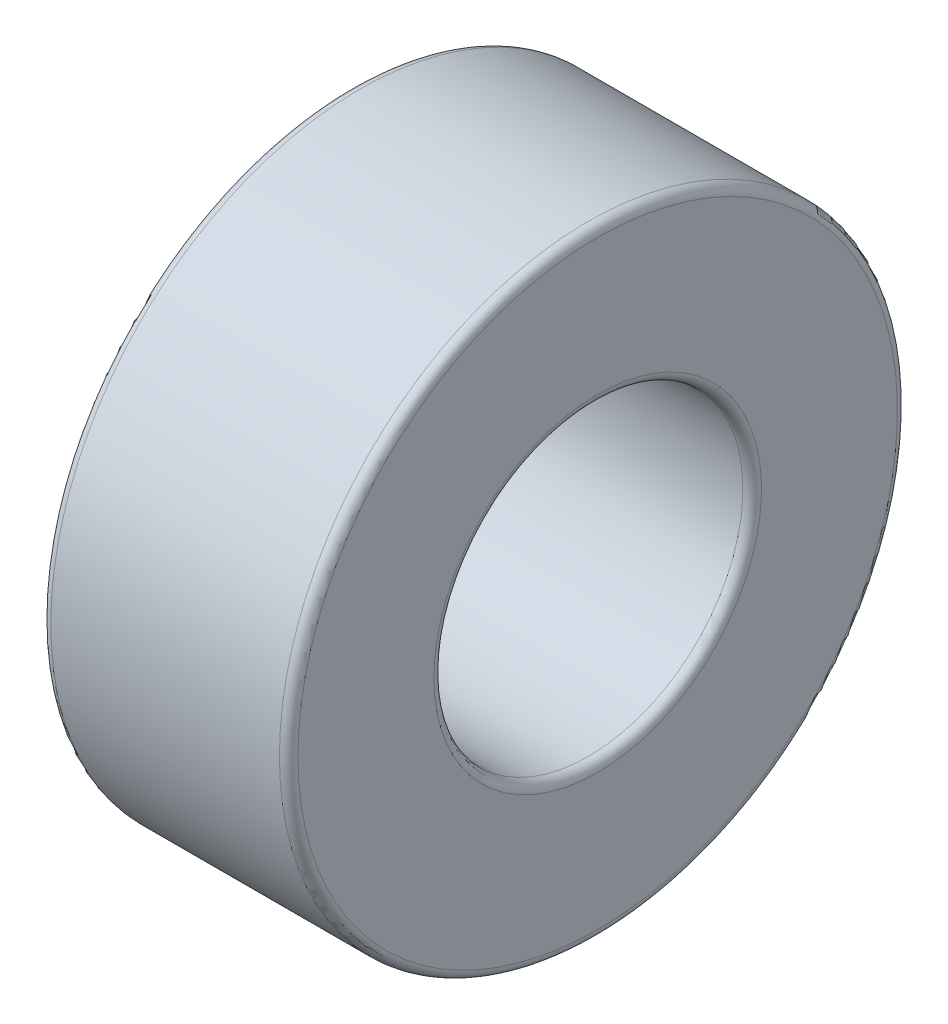
ISO-10303-21;
HEADER;
FILE_DESCRIPTION(('STEP AP214'),'2;1');
FILE_NAME('part.step','',(''),(''),'','','');
FILE_SCHEMA(('AUTOMOTIVE_DESIGN { 1 0 10303 214 1 1 1 1 }'));
ENDSEC;
DATA;
#1=APPLICATION_CONTEXT('core data for automotive mechanical design processes');
#2=APPLICATION_PROTOCOL_DEFINITION('international standard','automotive_design',2000,#1);
#3=PRODUCT_CONTEXT('',#1,'mechanical');
#4=PRODUCT('Part','Part','',(#3));
#5=PRODUCT_RELATED_PRODUCT_CATEGORY('part','',(#4));
#6=PRODUCT_DEFINITION_FORMATION('','',#4);
#7=PRODUCT_DEFINITION_CONTEXT('part definition',#1,'design');
#8=PRODUCT_DEFINITION('design','',#6,#7);
#9=PRODUCT_DEFINITION_SHAPE('','',#8);
#10=(LENGTH_UNIT() NAMED_UNIT(*) SI_UNIT(.MILLI.,.METRE.));
#11=(NAMED_UNIT(*) PLANE_ANGLE_UNIT() SI_UNIT($,.RADIAN.));
#12=(NAMED_UNIT(*) SI_UNIT($,.STERADIAN.) SOLID_ANGLE_UNIT());
#13=UNCERTAINTY_MEASURE_WITH_UNIT(LENGTH_MEASURE(1.E-05),#10,'distance_accuracy_value','');
#14=(GEOMETRIC_REPRESENTATION_CONTEXT(3) GLOBAL_UNCERTAINTY_ASSIGNED_CONTEXT((#13)) GLOBAL_UNIT_ASSIGNED_CONTEXT((#10,
#11,#12)) REPRESENTATION_CONTEXT('',''));
#15=CARTESIAN_POINT('',(0.,0.,0.));
#16=DIRECTION('',(0.,0.,1.));
#17=DIRECTION('',(1.,0.,0.));
#18=AXIS2_PLACEMENT_3D('',#15,#16,#17);
#19=CARTESIAN_POINT('',(0.15,0.,0.));
#20=DIRECTION('',(-1.,0.,0.));
#21=DIRECTION('',(0.,0.,1.));
#22=AXIS2_PLACEMENT_3D('',#19,#20,#21);
#23=CYLINDRICAL_SURFACE('',#22,2.5);
#24=CARTESIAN_POINT('',(3.85,0.,0.));
#25=DIRECTION('',(-1.,0.,0.));
#26=DIRECTION('',(0.,0.,1.));
#27=AXIS2_PLACEMENT_3D('',#24,#25,#26);
#28=CIRCLE('',#27,2.5);
#29=CARTESIAN_POINT('',(3.85,0.,2.5));
#30=VERTEX_POINT('',#29);
#31=EDGE_CURVE('E9',#30,#30,#28,.T.);
#32=ORIENTED_EDGE('',*,*,#31,.F.);
#33=EDGE_LOOP('',(#32));
#34=FACE_BOUND('',#33,.T.);
#35=CARTESIAN_POINT('',(0.15,0.,0.));
#36=DIRECTION('',(-1.,0.,0.));
#37=DIRECTION('',(0.,0.,1.));
#38=AXIS2_PLACEMENT_3D('',#35,#36,#37);
#39=CIRCLE('',#38,2.5);
#40=CARTESIAN_POINT('',(0.15,0.,2.5));
#41=VERTEX_POINT('',#40);
#42=EDGE_CURVE('E83',#41,#41,#39,.T.);
#43=ORIENTED_EDGE('',*,*,#42,.T.);
#44=EDGE_LOOP('',(#43));
#45=FACE_BOUND('',#44,.T.);
#46=ADVANCED_FACE('F14',(#34,#45),#23,.F.);
#47=CARTESIAN_POINT('',(3.85,0.,0.));
#48=DIRECTION('',(-1.,0.,0.));
#49=DIRECTION('',(0.,0.,1.));
#50=AXIS2_PLACEMENT_3D('',#47,#48,#49);
#51=TOROIDAL_SURFACE('',#50,2.65,0.15);
#52=CARTESIAN_POINT('',(4.,0.,0.));
#53=DIRECTION('',(-1.,0.,0.));
#54=DIRECTION('',(0.,0.,1.));
#55=AXIS2_PLACEMENT_3D('',#52,#53,#54);
#56=CIRCLE('',#55,2.65);
#57=CARTESIAN_POINT('',(4.,0.,2.65));
#58=VERTEX_POINT('',#57);
#59=EDGE_CURVE('E23',#58,#58,#56,.T.);
#60=ORIENTED_EDGE('',*,*,#59,.F.);
#61=EDGE_LOOP('',(#60));
#62=FACE_BOUND('',#61,.T.);
#63=ORIENTED_EDGE('',*,*,#31,.T.);
#64=EDGE_LOOP('',(#63));
#65=FACE_BOUND('',#64,.T.);
#66=ADVANCED_FACE('F113',(#62,#65),#51,.T.);
#67=CARTESIAN_POINT('',(4.,2.65,0.));
#68=DIRECTION('',(-1.,0.,0.));
#69=DIRECTION('',(0.,0.,1.));
#70=AXIS2_PLACEMENT_3D('',#67,#68,#69);
#71=PLANE('',#70);
#72=CARTESIAN_POINT('',(4.,0.,0.));
#73=DIRECTION('',(-1.,0.,0.));
#74=DIRECTION('',(0.,0.,1.));
#75=AXIS2_PLACEMENT_3D('',#72,#73,#74);
#76=CIRCLE('',#75,4.85);
#77=CARTESIAN_POINT('',(4.,0.,4.85));
#78=VERTEX_POINT('',#77);
#79=EDGE_CURVE('E33',#78,#78,#76,.T.);
#80=ORIENTED_EDGE('',*,*,#79,.F.);
#81=EDGE_LOOP('',(#80));
#82=FACE_BOUND('',#81,.T.);
#83=ORIENTED_EDGE('',*,*,#59,.T.);
#84=EDGE_LOOP('',(#83));
#85=FACE_BOUND('',#84,.T.);
#86=ADVANCED_FACE('F110',(#82,#85),#71,.F.);
#87=CARTESIAN_POINT('',(3.85,0.,0.));
#88=DIRECTION('',(-1.,0.,0.));
#89=DIRECTION('',(0.,0.,1.));
#90=AXIS2_PLACEMENT_3D('',#87,#88,#89);
#91=TOROIDAL_SURFACE('',#90,4.85,0.15);
#92=CARTESIAN_POINT('',(3.85,0.,0.));
#93=DIRECTION('',(-1.,0.,0.));
#94=DIRECTION('',(0.,0.,1.));
#95=AXIS2_PLACEMENT_3D('',#92,#93,#94);
#96=CIRCLE('',#95,5.);
#97=CARTESIAN_POINT('',(3.85,0.,5.));
#98=VERTEX_POINT('',#97);
#99=EDGE_CURVE('E98',#98,#98,#96,.T.);
#100=ORIENTED_EDGE('',*,*,#99,.F.);
#101=EDGE_LOOP('',(#100));
#102=FACE_BOUND('',#101,.T.);
#103=ORIENTED_EDGE('',*,*,#79,.T.);
#104=EDGE_LOOP('',(#103));
#105=FACE_BOUND('',#104,.T.);
#106=ADVANCED_FACE('F108',(#102,#105),#91,.T.);
#107=CARTESIAN_POINT('',(0.15,0.,0.));
#108=DIRECTION('',(-1.,0.,0.));
#109=DIRECTION('',(0.,0.,1.));
#110=AXIS2_PLACEMENT_3D('',#107,#108,#109);
#111=CYLINDRICAL_SURFACE('',#110,5.);
#112=CARTESIAN_POINT('',(0.15,0.,0.));
#113=DIRECTION('',(-1.,0.,0.));
#114=DIRECTION('',(0.,0.,1.));
#115=AXIS2_PLACEMENT_3D('',#112,#113,#114);
#116=CIRCLE('',#115,5.);
#117=CARTESIAN_POINT('',(0.15,0.,5.));
#118=VERTEX_POINT('',#117);
#119=EDGE_CURVE('E94',#118,#118,#116,.T.);
#120=ORIENTED_EDGE('',*,*,#119,.F.);
#121=EDGE_LOOP('',(#120));
#122=FACE_BOUND('',#121,.T.);
#123=ORIENTED_EDGE('',*,*,#99,.T.);
#124=EDGE_LOOP('',(#123));
#125=FACE_BOUND('',#124,.T.);
#126=ADVANCED_FACE('F126',(#122,#125),#111,.T.);
#127=CARTESIAN_POINT('',(0.15,0.,0.));
#128=DIRECTION('',(-1.,0.,0.));
#129=DIRECTION('',(0.,0.,1.));
#130=AXIS2_PLACEMENT_3D('',#127,#128,#129);
#131=TOROIDAL_SURFACE('',#130,4.85,0.15);
#132=CARTESIAN_POINT('',(0.,0.,0.));
#133=DIRECTION('',(-1.,0.,0.));
#134=DIRECTION('',(0.,0.,1.));
#135=AXIS2_PLACEMENT_3D('',#132,#133,#134);
#136=CIRCLE('',#135,4.85);
#137=CARTESIAN_POINT('',(0.,0.,4.85));
#138=VERTEX_POINT('',#137);
#139=EDGE_CURVE('E90',#138,#138,#136,.T.);
#140=ORIENTED_EDGE('',*,*,#139,.F.);
#141=EDGE_LOOP('',(#140));
#142=FACE_BOUND('',#141,.T.);
#143=ORIENTED_EDGE('',*,*,#119,.T.);
#144=EDGE_LOOP('',(#143));
#145=FACE_BOUND('',#144,.T.);
#146=ADVANCED_FACE('F130',(#142,#145),#131,.T.);
#147=CARTESIAN_POINT('',(0.,2.65,0.));
#148=DIRECTION('',(-1.,0.,0.));
#149=DIRECTION('',(0.,0.,1.));
#150=AXIS2_PLACEMENT_3D('',#147,#148,#149);
#151=PLANE('',#150);
#152=ORIENTED_EDGE('',*,*,#139,.T.);
#153=EDGE_LOOP('',(#152));
#154=FACE_BOUND('',#153,.T.);
#155=CARTESIAN_POINT('',(0.,0.,0.));
#156=DIRECTION('',(-1.,0.,0.));
#157=DIRECTION('',(0.,0.,1.));
#158=AXIS2_PLACEMENT_3D('',#155,#156,#157);
#159=CIRCLE('',#158,2.65);
#160=CARTESIAN_POINT('',(0.,0.,2.65));
#161=VERTEX_POINT('',#160);
#162=EDGE_CURVE('E86',#161,#161,#159,.T.);
#163=ORIENTED_EDGE('',*,*,#162,.F.);
#164=EDGE_LOOP('',(#163));
#165=FACE_BOUND('',#164,.T.);
#166=ADVANCED_FACE('F134',(#154,#165),#151,.T.);
#167=CARTESIAN_POINT('',(0.15,0.,0.));
#168=DIRECTION('',(-1.,0.,0.));
#169=DIRECTION('',(0.,0.,1.));
#170=AXIS2_PLACEMENT_3D('',#167,#168,#169);
#171=TOROIDAL_SURFACE('',#170,2.65,0.15);
#172=ORIENTED_EDGE('',*,*,#42,.F.);
#173=EDGE_LOOP('',(#172));
#174=FACE_BOUND('',#173,.T.);
#175=ORIENTED_EDGE('',*,*,#162,.T.);
#176=EDGE_LOOP('',(#175));
#177=FACE_BOUND('',#176,.T.);
#178=ADVANCED_FACE('F138',(#174,#177),#171,.T.);
#179=CLOSED_SHELL('',(#46,#66,#86,#106,#126,#146,#166,#178));
#180=CARTESIAN_POINT('',(0.75,0.,0.));
#181=DIRECTION('',(-1.,0.,0.));
#182=DIRECTION('',(0.,0.,-1.));
#183=AXIS2_PLACEMENT_3D('',#180,#181,#182);
#184=CYLINDRICAL_SURFACE('',#183,3.6825);
#185=CARTESIAN_POINT('',(1.9325,0.,0.));
#186=DIRECTION('',(-1.,0.,0.));
#187=DIRECTION('',(0.,-1.,0.));
#188=AXIS2_PLACEMENT_3D('',#185,#186,#187);
#189=CIRCLE('',#188,3.6825);
#190=CARTESIAN_POINT('',(1.9325,-3.6825,0.));
#191=VERTEX_POINT('',#190);
#192=EDGE_CURVE('E63',#191,#191,#189,.T.);
#193=ORIENTED_EDGE('',*,*,#192,.T.);
#194=EDGE_LOOP('',(#193));
#195=FACE_BOUND('',#194,.T.);
#196=CARTESIAN_POINT('',(0.75,0.,0.));
#197=DIRECTION('',(-1.,0.,0.));
#198=DIRECTION('',(0.,0.,-1.));
#199=AXIS2_PLACEMENT_3D('',#196,#197,#198);
#200=CIRCLE('',#199,3.6825);
#201=CARTESIAN_POINT('',(0.75,0.,-3.6825));
#202=VERTEX_POINT('',#201);
#203=EDGE_CURVE('E79',#202,#202,#200,.T.);
#204=ORIENTED_EDGE('',*,*,#203,.F.);
#205=EDGE_LOOP('',(#204));
#206=FACE_BOUND('',#205,.T.);
#207=ADVANCED_FACE('F149',(#195,#206),#184,.T.);
#208=CARTESIAN_POINT('',(0.75,0.,0.));
#209=DIRECTION('',(-1.,0.,0.));
#210=DIRECTION('',(0.,0.,-1.));
#211=AXIS2_PLACEMENT_3D('',#208,#209,#210);
#212=CYLINDRICAL_SURFACE('',#211,3.8175);
#213=CARTESIAN_POINT('',(1.9325,0.,0.));
#214=DIRECTION('',(-1.,0.,0.));
#215=DIRECTION('',(0.,-1.,0.));
#216=AXIS2_PLACEMENT_3D('',#213,#214,#215);
#217=CIRCLE('',#216,3.8175);
#218=CARTESIAN_POINT('',(1.9325,-3.8175,0.));
#219=VERTEX_POINT('',#218);
#220=EDGE_CURVE('E17',#219,#219,#217,.F.);
#221=ORIENTED_EDGE('',*,*,#220,.T.);
#222=EDGE_LOOP('',(#221));
#223=FACE_BOUND('',#222,.T.);
#224=CARTESIAN_POINT('',(0.75,0.,0.));
#225=DIRECTION('',(-1.,0.,0.));
#226=DIRECTION('',(0.,0.,-1.));
#227=AXIS2_PLACEMENT_3D('',#224,#225,#226);
#228=CIRCLE('',#227,3.8175);
#229=CARTESIAN_POINT('',(0.75,0.,-3.8175));
#230=VERTEX_POINT('',#229);
#231=EDGE_CURVE('E75',#230,#230,#228,.T.);
#232=ORIENTED_EDGE('',*,*,#231,.T.);
#233=EDGE_LOOP('',(#232));
#234=FACE_BOUND('',#233,.T.);
#235=ADVANCED_FACE('F155',(#223,#234),#212,.F.);
#236=CARTESIAN_POINT('',(0.75,-3.6825,0.));
#237=DIRECTION('',(-1.,0.,0.));
#238=DIRECTION('',(0.,0.,-1.));
#239=AXIS2_PLACEMENT_3D('',#236,#237,#238);
#240=PLANE('',#239);
#241=ORIENTED_EDGE('',*,*,#231,.F.);
#242=EDGE_LOOP('',(#241));
#243=FACE_BOUND('',#242,.T.);
#244=ORIENTED_EDGE('',*,*,#203,.T.);
#245=EDGE_LOOP('',(#244));
#246=FACE_BOUND('',#245,.T.);
#247=ADVANCED_FACE('F151',(#243,#246),#240,.F.);
#248=CARTESIAN_POINT('',(1.9325,-3.33333333333333,0.));
#249=DIRECTION('',(-1.,0.,0.));
#250=DIRECTION('',(0.,0.,-1.));
#251=AXIS2_PLACEMENT_3D('',#248,#249,#250);
#252=PLANE('',#251);
#253=CARTESIAN_POINT('',(1.9325,0.,0.));
#254=DIRECTION('',(-1.,0.,0.));
#255=DIRECTION('',(0.,0.,-1.));
#256=AXIS2_PLACEMENT_3D('',#253,#254,#255);
#257=CIRCLE('',#256,4.16666666666667);
#258=CARTESIAN_POINT('',(1.9325,0.,-4.16666666666667));
#259=VERTEX_POINT('',#258);
#260=EDGE_CURVE('E51',#259,#259,#257,.T.);
#261=ORIENTED_EDGE('',*,*,#260,.F.);
#262=EDGE_LOOP('',(#261));
#263=FACE_BOUND('',#262,.T.);
#264=ORIENTED_EDGE('',*,*,#220,.F.);
#265=EDGE_LOOP('',(#264));
#266=FACE_BOUND('',#265,.T.);
#267=ADVANCED_FACE('F154',(#263,#266),#252,.F.);
#268=CARTESIAN_POINT('',(1.9325,0.,0.));
#269=DIRECTION('',(-1.,0.,0.));
#270=DIRECTION('',(0.,0.,-1.));
#271=AXIS2_PLACEMENT_3D('',#268,#269,#270);
#272=CYLINDRICAL_SURFACE('',#271,4.16666666666667);
#273=CARTESIAN_POINT('',(2.0675,0.,0.));
#274=DIRECTION('',(-1.,0.,0.));
#275=DIRECTION('',(0.,0.,-1.));
#276=AXIS2_PLACEMENT_3D('',#273,#274,#275);
#277=CIRCLE('',#276,4.16666666666667);
#278=CARTESIAN_POINT('',(2.0675,0.,-4.16666666666667));
#279=VERTEX_POINT('',#278);
#280=EDGE_CURVE('E59',#279,#279,#277,.T.);
#281=ORIENTED_EDGE('',*,*,#280,.F.);
#282=EDGE_LOOP('',(#281));
#283=FACE_BOUND('',#282,.T.);
#284=ORIENTED_EDGE('',*,*,#260,.T.);
#285=EDGE_LOOP('',(#284));
#286=FACE_BOUND('',#285,.T.);
#287=ADVANCED_FACE('F171',(#283,#286),#272,.F.);
#288=CARTESIAN_POINT('',(2.0675,-4.16666666666667,0.));
#289=DIRECTION('',(1.,0.,0.));
#290=DIRECTION('',(0.,0.,1.));
#291=AXIS2_PLACEMENT_3D('',#288,#289,#290);
#292=PLANE('',#291);
#293=ORIENTED_EDGE('',*,*,#280,.T.);
#294=EDGE_LOOP('',(#293));
#295=FACE_BOUND('',#294,.T.);
#296=CARTESIAN_POINT('',(2.0675,0.,0.));
#297=DIRECTION('',(1.,0.,0.));
#298=DIRECTION('',(0.,1.,0.));
#299=AXIS2_PLACEMENT_3D('',#296,#297,#298);
#300=CIRCLE('',#299,3.8175);
#301=CARTESIAN_POINT('',(2.0675,3.8175,0.));
#302=VERTEX_POINT('',#301);
#303=EDGE_CURVE('E36',#302,#302,#300,.F.);
#304=ORIENTED_EDGE('',*,*,#303,.F.);
#305=EDGE_LOOP('',(#304));
#306=FACE_BOUND('',#305,.T.);
#307=ADVANCED_FACE('F170',(#295,#306),#292,.F.);
#308=CARTESIAN_POINT('',(1.9325,0.,0.));
#309=DIRECTION('',(-1.,0.,0.));
#310=DIRECTION('',(0.,0.,-1.));
#311=AXIS2_PLACEMENT_3D('',#308,#309,#310);
#312=CIRCLE('',#311,3.33333333333333);
#313=CARTESIAN_POINT('',(1.9325,0.,-3.33333333333333));
#314=VERTEX_POINT('',#313);
#315=EDGE_CURVE('E40',#314,#314,#312,.T.);
#316=ORIENTED_EDGE('',*,*,#315,.T.);
#317=EDGE_LOOP('',(#316));
#318=FACE_BOUND('',#317,.T.);
#319=ORIENTED_EDGE('',*,*,#192,.F.);
#320=EDGE_LOOP('',(#319));
#321=FACE_BOUND('',#320,.T.);
#322=ADVANCED_FACE('F167',(#318,#321),#252,.F.);
#323=CARTESIAN_POINT('',(2.0675,0.,0.));
#324=DIRECTION('',(-1.,0.,0.));
#325=DIRECTION('',(0.,0.,-1.));
#326=AXIS2_PLACEMENT_3D('',#323,#324,#325);
#327=CIRCLE('',#326,3.33333333333333);
#328=CARTESIAN_POINT('',(2.0675,0.,-3.33333333333333));
#329=VERTEX_POINT('',#328);
#330=EDGE_CURVE('E231',#329,#329,#327,.T.);
#331=ORIENTED_EDGE('',*,*,#330,.F.);
#332=EDGE_LOOP('',(#331));
#333=FACE_BOUND('',#332,.T.);
#334=CARTESIAN_POINT('',(2.0675,0.,0.));
#335=DIRECTION('',(1.,0.,0.));
#336=DIRECTION('',(0.,1.,0.));
#337=AXIS2_PLACEMENT_3D('',#334,#335,#336);
#338=CIRCLE('',#337,3.6825);
#339=CARTESIAN_POINT('',(2.0675,3.6825,0.));
#340=VERTEX_POINT('',#339);
#341=EDGE_CURVE('E39',#340,#340,#338,.T.);
#342=ORIENTED_EDGE('',*,*,#341,.F.);
#343=EDGE_LOOP('',(#342));
#344=FACE_BOUND('',#343,.T.);
#345=ADVANCED_FACE('F165',(#333,#344),#292,.F.);
#346=CARTESIAN_POINT('',(1.9325,0.,0.));
#347=DIRECTION('',(-1.,0.,0.));
#348=DIRECTION('',(0.,0.,-1.));
#349=AXIS2_PLACEMENT_3D('',#346,#347,#348);
#350=CYLINDRICAL_SURFACE('',#349,3.33333333333333);
#351=ORIENTED_EDGE('',*,*,#315,.F.);
#352=EDGE_LOOP('',(#351));
#353=FACE_BOUND('',#352,.T.);
#354=ORIENTED_EDGE('',*,*,#330,.T.);
#355=EDGE_LOOP('',(#354));
#356=FACE_BOUND('',#355,.T.);
#357=ADVANCED_FACE('F147',(#353,#356),#350,.T.);
#358=ORIENTED_EDGE('',*,*,#341,.T.);
#359=EDGE_LOOP('',(#358));
#360=FACE_BOUND('',#359,.T.);
#361=CARTESIAN_POINT('',(3.25,0.,0.));
#362=DIRECTION('',(-1.,0.,0.));
#363=DIRECTION('',(0.,0.,-1.));
#364=AXIS2_PLACEMENT_3D('',#361,#362,#363);
#365=CIRCLE('',#364,3.6825);
#366=CARTESIAN_POINT('',(3.25,0.,-3.6825));
#367=VERTEX_POINT('',#366);
#368=EDGE_CURVE('E67',#367,#367,#365,.T.);
#369=ORIENTED_EDGE('',*,*,#368,.T.);
#370=EDGE_LOOP('',(#369));
#371=FACE_BOUND('',#370,.T.);
#372=ADVANCED_FACE('F143',(#360,#371),#184,.T.);
#373=CARTESIAN_POINT('',(3.25,-3.8175,0.));
#374=DIRECTION('',(1.,0.,0.));
#375=DIRECTION('',(0.,0.,1.));
#376=AXIS2_PLACEMENT_3D('',#373,#374,#375);
#377=PLANE('',#376);
#378=ORIENTED_EDGE('',*,*,#368,.F.);
#379=EDGE_LOOP('',(#378));
#380=FACE_BOUND('',#379,.T.);
#381=CARTESIAN_POINT('',(3.25,0.,0.));
#382=DIRECTION('',(-1.,0.,0.));
#383=DIRECTION('',(0.,0.,-1.));
#384=AXIS2_PLACEMENT_3D('',#381,#382,#383);
#385=CIRCLE('',#384,3.8175);
#386=CARTESIAN_POINT('',(3.25,0.,-3.8175));
#387=VERTEX_POINT('',#386);
#388=EDGE_CURVE('E71',#387,#387,#385,.T.);
#389=ORIENTED_EDGE('',*,*,#388,.T.);
#390=EDGE_LOOP('',(#389));
#391=FACE_BOUND('',#390,.T.);
#392=ADVANCED_FACE('F146',(#380,#391),#377,.F.);
#393=ORIENTED_EDGE('',*,*,#303,.T.);
#394=EDGE_LOOP('',(#393));
#395=FACE_BOUND('',#394,.T.);
#396=ORIENTED_EDGE('',*,*,#388,.F.);
#397=EDGE_LOOP('',(#396));
#398=FACE_BOUND('',#397,.T.);
#399=ADVANCED_FACE('F157',(#395,#398),#212,.F.);
#400=CLOSED_SHELL('',(#207,#235,#247,#267,#287,#307,#322,#345,#357,#372,#392,#399));
#401=ORIENTED_CLOSED_SHELL('',*,#400,.T.);
#402=BREP_WITH_VOIDS('B1',#179,(#401));
#403=ADVANCED_BREP_SHAPE_REPRESENTATION('',(#18,#402),#14);
#404=SHAPE_DEFINITION_REPRESENTATION(#9,#403);
ENDSEC;
END-ISO-10303-21;
